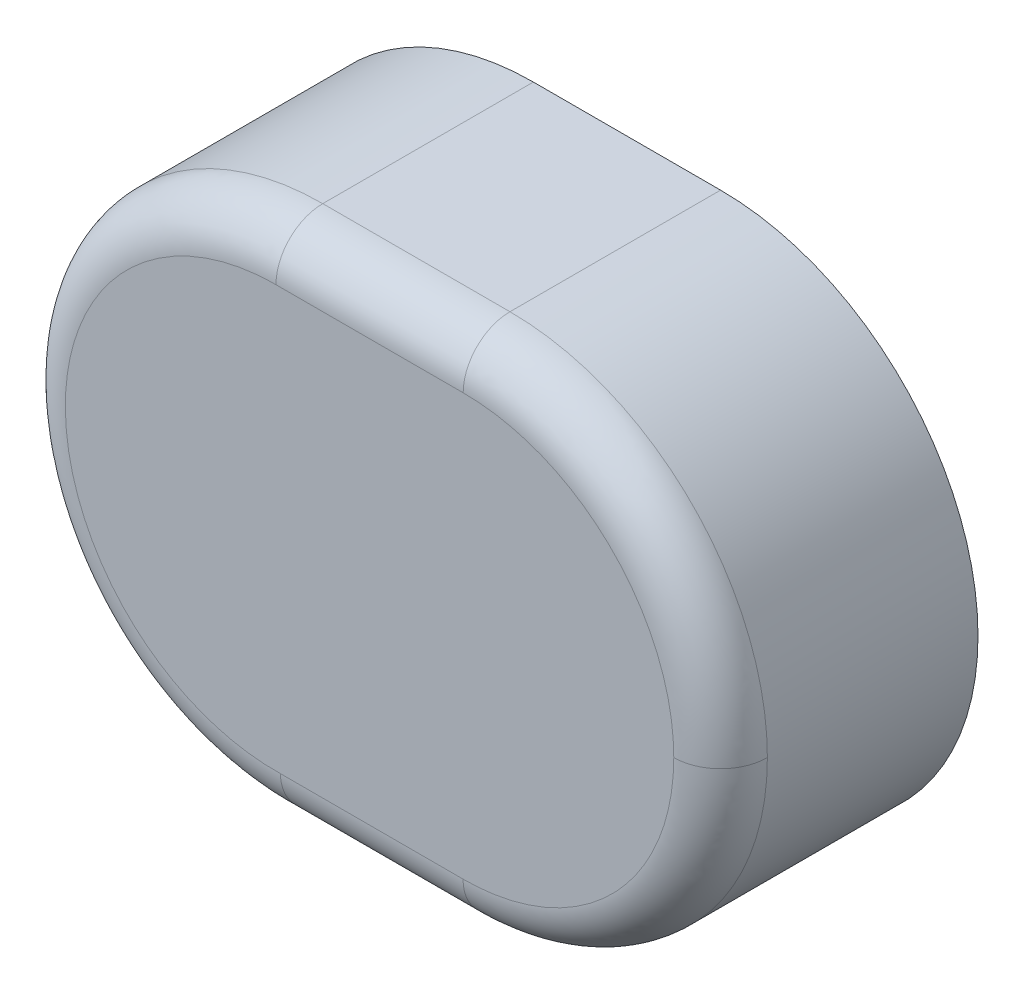
ISO-10303-21;
HEADER;
FILE_DESCRIPTION(('STEP AP214'),'2;1');
FILE_NAME('part.step','',(''),(''),'','','');
FILE_SCHEMA(('AUTOMOTIVE_DESIGN { 1 0 10303 214 1 1 1 1 }'));
ENDSEC;
DATA;
#1=APPLICATION_CONTEXT('core data for automotive mechanical design processes');
#2=APPLICATION_PROTOCOL_DEFINITION('international standard','automotive_design',2000,#1);
#3=PRODUCT_CONTEXT('',#1,'mechanical');
#4=PRODUCT('Part','Part','',(#3));
#5=PRODUCT_RELATED_PRODUCT_CATEGORY('part','',(#4));
#6=PRODUCT_DEFINITION_FORMATION('','',#4);
#7=PRODUCT_DEFINITION_CONTEXT('part definition',#1,'design');
#8=PRODUCT_DEFINITION('design','',#6,#7);
#9=PRODUCT_DEFINITION_SHAPE('','',#8);
#10=(LENGTH_UNIT() NAMED_UNIT(*) SI_UNIT(.MILLI.,.METRE.));
#11=(NAMED_UNIT(*) PLANE_ANGLE_UNIT() SI_UNIT($,.RADIAN.));
#12=(NAMED_UNIT(*) SI_UNIT($,.STERADIAN.) SOLID_ANGLE_UNIT());
#13=UNCERTAINTY_MEASURE_WITH_UNIT(LENGTH_MEASURE(1.E-05),#10,'distance_accuracy_value','');
#14=(GEOMETRIC_REPRESENTATION_CONTEXT(3) GLOBAL_UNCERTAINTY_ASSIGNED_CONTEXT((#13)) GLOBAL_UNIT_ASSIGNED_CONTEXT((#10,
#11,#12)) REPRESENTATION_CONTEXT('',''));
#15=CARTESIAN_POINT('',(0.,0.,0.));
#16=DIRECTION('',(0.,0.,1.));
#17=DIRECTION('',(1.,0.,0.));
#18=AXIS2_PLACEMENT_3D('',#15,#16,#17);
#19=CARTESIAN_POINT('',(-0.4,0.,1.1));
#20=DIRECTION('',(0.,0.,1.));
#21=DIRECTION('',(1.,0.,0.));
#22=AXIS2_PLACEMENT_3D('',#19,#20,#21);
#23=PLANE('',#22);
#24=CARTESIAN_POINT('',(0.4,0.9,1.1));
#25=CARTESIAN_POINT('',(0.927207793884,0.9,1.1));
#26=CARTESIAN_POINT('',(1.300000000025,0.527207793841,1.1));
#27=CARTESIAN_POINT('',(1.300000075144,-8.663971320906E-11,1.1));
#28=(BOUNDED_CURVE() B_SPLINE_CURVE(3,(#24,#25,#26,#27),.UNSPECIFIED.,.F.,
.F.) B_SPLINE_CURVE_WITH_KNOTS((4,4),(0.,0.499907037616),
.UNSPECIFIED.) CURVE() GEOMETRIC_REPRESENTATION_ITEM() RATIONAL_B_SPLINE_CURVE((1.,
0.804737854113,0.804737854113,1.)) REPRESENTATION_ITEM(''));
#29=CARTESIAN_POINT('',(0.4,0.9,1.1));
#30=VERTEX_POINT('',#29);
#31=CARTESIAN_POINT('',(1.300000075144,-8.663971320906E-11,1.1));
#32=VERTEX_POINT('',#31);
#33=EDGE_CURVE('E121',#30,#32,#28,.T.);
#34=ORIENTED_EDGE('',*,*,#33,.F.);
#35=DIRECTION('',(1.,0.,0.));
#36=VECTOR('',#35,1.);
#37=CARTESIAN_POINT('',(-0.4,0.9,1.1));
#38=LINE('',#37,#36);
#39=CARTESIAN_POINT('',(-0.4,0.9,1.1));
#40=VERTEX_POINT('',#39);
#41=EDGE_CURVE('E50',#40,#30,#38,.T.);
#42=ORIENTED_EDGE('',*,*,#41,.F.);
#43=CARTESIAN_POINT('',(-0.380779125953,-0.899794729347,1.1));
#44=CARTESIAN_POINT('',(-0.912340616922,-0.911149628008001,1.1));
#45=CARTESIAN_POINT('',(-1.294270909059,-0.541263423461,1.1));
#46=CARTESIAN_POINT('',(-1.299948681296,-0.009610985049351,1.1));
#47=CARTESIAN_POINT('',(-1.305626453533,0.522041453362,1.1));
#48=CARTESIAN_POINT('',(-0.931682755378,0.9,1.1));
#49=CARTESIAN_POINT('',(-0.4,0.9,1.1));
#50=(BOUNDED_CURVE() B_SPLINE_CURVE(3,(#43,#44,#45,#46,#47,#48,#49),.UNSPECIFIED.,.F.,
.F.) B_SPLINE_CURVE_WITH_KNOTS((4,3,4),(0.,0.5,1.),
.UNSPECIFIED.) CURVE() GEOMETRIC_REPRESENTATION_ITEM() RATIONAL_B_SPLINE_CURVE((1.,
0.802214063897,0.802214063897,1.,0.802214063897,0.802214063897,1.)) REPRESENTATION_ITEM(''));
#51=CARTESIAN_POINT('',(-0.380779125953,-0.899794729347,1.1));
#52=VERTEX_POINT('',#51);
#53=EDGE_CURVE('E198',#52,#40,#50,.T.);
#54=ORIENTED_EDGE('',*,*,#53,.F.);
#55=DIRECTION('',(-0.999999965443406,0.000262893868867007,0.));
#56=VECTOR('',#55,1.);
#57=CARTESIAN_POINT('',(-0.400236549179,-0.899789607352,1.1));
#58=LINE('',#57,#56);
#59=CARTESIAN_POINT('',(0.399474212286,-0.899999846415,1.1));
#60=VERTEX_POINT('',#59);
#61=EDGE_CURVE('E11',#60,#52,#58,.T.);
#62=ORIENTED_EDGE('',*,*,#61,.F.);
#63=CARTESIAN_POINT('',(1.300000075144,-8.663971320906E-11,1.1));
#64=CARTESIAN_POINT('',(1.299999999975,-0.527452036945,1.1));
#65=CARTESIAN_POINT('',(0.92692615918,-0.900307988415,1.1));
#66=CARTESIAN_POINT('',(0.399474212286,-0.899999846415,1.1));
#67=(BOUNDED_CURVE() B_SPLINE_CURVE(3,(#63,#64,#65,#66),.UNSPECIFIED.,.F.,
.F.) B_SPLINE_CURVE_WITH_KNOTS((4,4),(0.499907037616,1.),
.UNSPECIFIED.) CURVE() GEOMETRIC_REPRESENTATION_ITEM() RATIONAL_B_SPLINE_CURVE((1.,
0.804600134738,0.804600134738,1.)) REPRESENTATION_ITEM(''));
#68=EDGE_CURVE('E115',#32,#60,#67,.T.);
#69=ORIENTED_EDGE('',*,*,#68,.F.);
#70=EDGE_LOOP('',(#34,#42,#54,#62,#69));
#71=FACE_BOUND('',#70,.T.);
#72=ADVANCED_FACE('F17',(#71),#23,.T.);
#73=CARTESIAN_POINT('',(-0.400236549181,-0.899789615799,0.9));
#74=DIRECTION('',(-0.999999965443406,0.000262893868867007,0.));
#75=DIRECTION('',(-0.000262893868867007,-0.999999965443406,0.));
#76=AXIS2_PLACEMENT_3D('',#73,#74,#75);
#77=CYLINDRICAL_SURFACE('',#76,0.2);
#78=CARTESIAN_POINT('',(0.399474212282,-0.899999854862,0.9));
#79=DIRECTION('',(0.999999965443406,-0.000262893868867007,0.));
#80=DIRECTION('',(-0.000262893868867007,-0.999999965443406,0.));
#81=AXIS2_PLACEMENT_3D('',#78,#79,#80);
#82=CIRCLE('',#81,0.2);
#83=CARTESIAN_POINT('',(0.399421633509,-1.099999847951,0.9));
#84=VERTEX_POINT('',#83);
#85=EDGE_CURVE('E31',#60,#84,#82,.T.);
#86=ORIENTED_EDGE('',*,*,#85,.F.);
#87=ORIENTED_EDGE('',*,*,#61,.T.);
#88=CARTESIAN_POINT('',(-0.378777908656016,-1.09979526405521,0.9));
#89=CARTESIAN_POINT('',(-0.378754036193757,-1.09979485149569,0.902972997488492));
#90=CARTESIAN_POINT('',(-0.378731664842678,-1.0997280704236,0.905945997560975));
#91=CARTESIAN_POINT('',(-0.37868954140025,-1.09945976885765,0.911938418727411));
#92=CARTESIAN_POINT('',(-0.378669842390077,-1.09925589559782,0.914957735017651));
#93=CARTESIAN_POINT('',(-0.378633217989936,-1.09870685421041,0.921034407228906));
#94=CARTESIAN_POINT('',(-0.378616344467314,-1.09835938119942,0.924091555365059));
#95=CARTESIAN_POINT('',(-0.378585514464656,-1.09751724662697,0.930234649728027));
#96=CARTESIAN_POINT('',(-0.378571608170194,-1.09702035081032,0.933320290054966));
#97=CARTESIAN_POINT('',(-0.378546843884385,-1.09587417079679,0.939510304169306));
#98=CARTESIAN_POINT('',(-0.378536033944641,-1.09522274444302,0.942614281624328));
#99=CARTESIAN_POINT('',(-0.378517578444724,-1.09376314462121,0.948830144002926));
#100=CARTESIAN_POINT('',(-0.378509978346392,-1.09295294273639,0.951941552867778));
#101=CARTESIAN_POINT('',(-0.378498040930228,-1.09117238486836,0.958160771166421));
#102=CARTESIAN_POINT('',(-0.378493746045126,-1.09020013491605,0.961268038544205));
#103=CARTESIAN_POINT('',(-0.378488497273082,-1.08809313686472,0.967466886973775));
#104=CARTESIAN_POINT('',(-0.378487582377898,-1.08695664852416,0.970557876638921));
#105=CARTESIAN_POINT('',(-0.378489149345602,-1.08451998932997,0.976711622832444));
#106=CARTESIAN_POINT('',(-0.378491666388873,-1.08321824914562,0.979773758031562));
#107=CARTESIAN_POINT('',(-0.3785001285278,-1.08045114321288,0.985856926358591));
#108=CARTESIAN_POINT('',(-0.378506104676643,-1.07898439352437,0.988877329981482));
#109=CARTESIAN_POINT('',(-0.378521490204661,-1.07588862900864,0.994863997169959));
#110=CARTESIAN_POINT('',(-0.378530926261018,-1.07425842684191,0.997829646731975));
#111=CARTESIAN_POINT('',(-0.378553209439725,-1.07083846108,1.00369376395147));
#112=CARTESIAN_POINT('',(-0.378566078692304,-1.06904771420541,1.00659165811116));
#113=CARTESIAN_POINT('',(-0.378595178017505,-1.06531072090647,1.01230739225771));
#114=CARTESIAN_POINT('',(-0.378611425589011,-1.06336369860312,1.01512472490465));
#115=CARTESIAN_POINT('',(-0.378647203018098,-1.05931956272602,1.02066681059603));
#116=CARTESIAN_POINT('',(-0.378666745751308,-1.05722187966446,1.02339114800928));
#117=CARTESIAN_POINT('',(-0.378709007037604,-1.05288313768865,1.02873524090113));
#118=CARTESIAN_POINT('',(-0.378731733946368,-1.0506417102456,1.03135469712094));
#119=CARTESIAN_POINT('',(-0.378780230112621,-1.04602343546422,1.03647771865106));
#120=CARTESIAN_POINT('',(-0.378806003403588,-1.04364641079473,1.03898112406548));
#121=CARTESIAN_POINT('',(-0.378860433345164,-1.03876604531191,1.04386158768415));
#122=CARTESIAN_POINT('',(-0.378889089994916,-1.03626270453609,1.04623864592592));
#123=CARTESIAN_POINT('',(-0.378949104160728,-1.03113984169101,1.0508569552979));
#124=CARTESIAN_POINT('',(-0.378980458011787,-1.02852047955118,1.05309838387966));
#125=CARTESIAN_POINT('',(-0.379045663069837,-1.02317660240385,1.05743709443839));
#126=CARTESIAN_POINT('',(-0.379079507389302,-1.02045238665186,1.05953474511283));
#127=CARTESIAN_POINT('',(-0.379149471746614,-1.01491056983084,1.06357878166556));
#128=CARTESIAN_POINT('',(-0.37918558217396,-1.01209338435821,1.06552573725056));
#129=CARTESIAN_POINT('',(-0.379259842189707,-1.0063779678881,1.06926256199871));
#130=CARTESIAN_POINT('',(-0.379297979986713,-1.00348024417013,1.07105320731095));
#131=CARTESIAN_POINT('',(-0.379376046694424,-0.99761648879174,1.07447293456294));
#132=CARTESIAN_POINT('',(-0.379415962200891,-0.994651030549239,1.07610300010326));
#133=CARTESIAN_POINT('',(-0.379497328341799,-0.988664764472242,1.07919845599785));
#134=CARTESIAN_POINT('',(-0.379538764536301,-0.985644570548345,1.08066503406282));
#135=CARTESIAN_POINT('',(-0.379622911701828,-0.979561837527449,1.08343176167503));
#136=CARTESIAN_POINT('',(-0.379665607767027,-0.976499927835743,1.08473329558165));
#137=CARTESIAN_POINT('',(-0.379752013453864,-0.970346645957682,1.08716950770469));
#138=CARTESIAN_POINT('',(-0.379795708251053,-0.96725589500027,1.08830575571644));
#139=CARTESIAN_POINT('',(-0.379883852645861,-0.961057534670954,1.09041223939604));
#140=CARTESIAN_POINT('',(-0.379928288011695,-0.957950516590615,1.09138421581195));
#141=CARTESIAN_POINT('',(-0.380017660345577,-0.951731804980451,1.09316419391585));
#142=CARTESIAN_POINT('',(-0.380062584138629,-0.948620653422168,1.09397409011737));
#143=CARTESIAN_POINT('',(-0.380152688471447,-0.942405311214057,1.09543304710009));
#144=CARTESIAN_POINT('',(-0.380197857301428,-0.939301596553903,1.09608413687602));
#145=CARTESIAN_POINT('',(-0.380288217651549,-0.933112111132864,1.09722961364919));
#146=CARTESIAN_POINT('',(-0.380333399273606,-0.930026736654881,1.09772614341015));
#147=CARTESIAN_POINT('',(-0.380423563948389,-0.923884174744724,1.09856751731588));
#148=CARTESIAN_POINT('',(-0.380468539197128,-0.920827293186012,1.09891459634674));
#149=CARTESIAN_POINT('',(-0.380558084547499,-0.914751152664416,1.09946282285997));
#150=CARTESIAN_POINT('',(-0.380602649152329,-0.911732101485765,1.09966627587597));
#151=CARTESIAN_POINT('',(-0.380691181777354,-0.905740206988542,1.09993371177135));
#152=CARTESIAN_POINT('',(-0.380735146770091,-0.902767468501069,1.10000004808143));
#153=CARTESIAN_POINT('',(-0.380779125916932,-0.899794731035435,1.1));
#154=B_SPLINE_CURVE_WITH_KNOTS('',3,(#88,#89,#90,#91,#92,#93,#94,#95,#96,#97,#98,#99,#100,#101,
#102,#103,#104,#105,#106,#107,#108,#109,#110,#111,#112,#113,#114,#115,#116,#117,#118,#119,#120,
#121,#122,#123,#124,#125,#126,#127,#128,#129,#130,#131,#132,#133,#134,#135,#136,#137,#138,#139,
#140,#141,#142,#143,#144,#145,#146,#147,#148,#149,#150,#151,#152,#153),.UNSPECIFIED.,.F.,.F.,(4,
2,2,2,2,2,2,2,2,2,2,2,2,2,2,2,2,2,2,2,2,2,2,2,2,2,2,2,2,2,2,2,4),(0.,0.00891854816367091,
0.0179942000842322,0.0272215582811506,0.0365943984439681,0.046105660467459,0.0557474491846384,
0.0655110457017221,0.0753869300517504,0.0853648156480489,0.0954336957399128,0.105581901758877,
0.11579717310587,0.126066737581289,0.136377401317439,0.146715646752711,0.157067736906173,
0.167419823985228,0.177758060200585,0.188068708581192,0.198338251581763,0.208553495357148,
0.21870166773622,0.22877050815395,0.238748348081058,0.248624180810689,0.258387719804175,
0.268029445146173,0.277540637997577,0.286913403248578,0.296140680853072,0.305216246561131,
0.314134702953651),.UNSPECIFIED.);
#155=CARTESIAN_POINT('',(-0.378777908656,-1.099795264056,0.9));
#156=VERTEX_POINT('',#155);
#157=EDGE_CURVE('E206',#156,#52,#154,.T.);
#158=ORIENTED_EDGE('',*,*,#157,.F.);
#159=DIRECTION('',(0.999999965443406,-0.000262893868867007,0.));
#160=VECTOR('',#159,1.);
#161=CARTESIAN_POINT('',(-0.378777908656,-1.099795264056,0.9));
#162=LINE('',#161,#160);
#163=EDGE_CURVE('E196',#156,#84,#162,.T.);
#164=ORIENTED_EDGE('',*,*,#163,.T.);
#165=EDGE_LOOP('',(#86,#87,#158,#164));
#166=FACE_BOUND('',#165,.T.);
#167=ADVANCED_FACE('F240',(#166),#77,.T.);
#168=CARTESIAN_POINT('',(0.390988907926,-0.89995488788,1.1));
#169=CARTESIAN_POINT('',(0.922365061059,-0.905275465063,1.1));
#170=CARTESIAN_POINT('',(1.3,-0.531402789474,1.1));
#171=CARTESIAN_POINT('',(1.3,0.,1.1));
#172=CARTESIAN_POINT('',(0.389815891142,-1.017106302946,1.1));
#173=CARTESIAN_POINT('',(0.990363809561001,-1.023119485008,1.1));
#174=CARTESIAN_POINT('',(1.417157287525,-0.600578022139,1.1));
#175=CARTESIAN_POINT('',(1.417157287525,0.,1.1));
#176=CARTESIAN_POINT('',(0.38898644302,-1.099944862965,1.017157287525));
#177=CARTESIAN_POINT('',(1.038446185739,-1.106447790633,1.017157287525));
#178=CARTESIAN_POINT('',(1.5,-0.649492298246,1.017157287525));
#179=CARTESIAN_POINT('',(1.5,0.,1.017157287525));
#180=CARTESIAN_POINT('',(0.38898644302,-1.099944862965,0.9));
#181=CARTESIAN_POINT('',(1.038446185739,-1.106447790633,0.9));
#182=CARTESIAN_POINT('',(1.5,-0.649492298246,0.9));
#183=CARTESIAN_POINT('',(1.5,0.,0.9));
#184=(BOUNDED_SURFACE() B_SPLINE_SURFACE(3,3,((#168,#169,#170,#171),(#172,#173,#174,#175),(#176,
#177,#178,#179),(#180,#181,#182,#183)),.UNSPECIFIED.,.F.,.F.,
.F.) B_SPLINE_SURFACE_WITH_KNOTS((4,4),(4,4),(0.,1.),(0.,1.),
.UNSPECIFIED.) GEOMETRIC_REPRESENTATION_ITEM() RATIONAL_B_SPLINE_SURFACE(((1.,0.802371989753,
0.802371989753,1.),(0.804737854124,0.645699113244,0.645699113244,0.804737854124),
(0.804737854124,0.645699113244,0.645699113244,0.804737854124),(1.,0.802371989753,0.802371989753,1.))) REPRESENTATION_ITEM('') SURFACE());
#185=CARTESIAN_POINT('',(1.3,0.,0.9));
#186=DIRECTION('',(0.,1.,0.));
#187=DIRECTION('',(1.,0.,0.));
#188=AXIS2_PLACEMENT_3D('',#185,#186,#187);
#189=CIRCLE('',#188,0.2);
#190=CARTESIAN_POINT('',(1.5,0.,0.9));
#191=VERTEX_POINT('',#190);
#192=EDGE_CURVE('E130',#32,#191,#189,.T.);
#193=CARTESIAN_POINT('',(0.4,0.,0.9));
#194=DIRECTION('',(0.,0.,-1.));
#195=DIRECTION('',(-1.,0.,0.));
#196=AXIS2_PLACEMENT_3D('',#193,#194,#195);
#197=CIRCLE('',#196,1.1);
#198=EDGE_CURVE('E192',#191,#84,#197,.T.);
#199=ORIENTED_EDGE('',*,*,#192,.F.);
#200=ORIENTED_EDGE('',*,*,#68,.T.);
#201=ORIENTED_EDGE('',*,*,#85,.T.);
#202=ORIENTED_EDGE('',*,*,#198,.F.);
#203=EDGE_LOOP('',(#199,#200,#201,#202));
#204=FACE_BOUND('',#203,.T.);
#205=ADVANCED_FACE('F19',(#204),#184,.T.);
#206=CARTESIAN_POINT('',(-0.4,0.9,0.9));
#207=DIRECTION('',(1.,0.,0.));
#208=DIRECTION('',(0.,1.,0.));
#209=AXIS2_PLACEMENT_3D('',#206,#207,#208);
#210=CYLINDRICAL_SURFACE('',#209,0.2);
#211=CARTESIAN_POINT('',(-0.4,0.9,0.9));
#212=DIRECTION('',(-1.,0.,0.));
#213=DIRECTION('',(0.,1.,0.));
#214=AXIS2_PLACEMENT_3D('',#211,#212,#213);
#215=CIRCLE('',#214,0.2);
#216=CARTESIAN_POINT('',(-0.4,1.1,0.9));
#217=VERTEX_POINT('',#216);
#218=EDGE_CURVE('E112',#40,#217,#215,.T.);
#219=ORIENTED_EDGE('',*,*,#218,.F.);
#220=ORIENTED_EDGE('',*,*,#41,.T.);
#221=CARTESIAN_POINT('',(0.4,0.9,0.9));
#222=DIRECTION('',(-1.,0.,0.));
#223=DIRECTION('',(0.,1.,0.));
#224=AXIS2_PLACEMENT_3D('',#221,#222,#223);
#225=CIRCLE('',#224,0.2);
#226=CARTESIAN_POINT('',(0.4,1.1,0.9));
#227=VERTEX_POINT('',#226);
#228=EDGE_CURVE('E110',#30,#227,#225,.T.);
#229=ORIENTED_EDGE('',*,*,#228,.T.);
#230=DIRECTION('',(-1.,0.,0.));
#231=VECTOR('',#230,1.);
#232=CARTESIAN_POINT('',(0.4,1.1,0.9));
#233=LINE('',#232,#231);
#234=EDGE_CURVE('E147',#227,#217,#233,.T.);
#235=ORIENTED_EDGE('',*,*,#234,.T.);
#236=EDGE_LOOP('',(#219,#220,#229,#235));
#237=FACE_BOUND('',#236,.T.);
#238=ADVANCED_FACE('F108',(#237),#210,.T.);
#239=CARTESIAN_POINT('',(-0.4,0.9,1.1));
#240=CARTESIAN_POINT('',(-0.935677416734,0.9,1.1));
#241=CARTESIAN_POINT('',(-1.310619741845,0.517418573845,1.1));
#242=CARTESIAN_POINT('',(-1.299816970816,-0.01814990444342,1.1));
#243=CARTESIAN_POINT('',(-1.289014199787,-0.553718382732,1.1));
#244=CARTESIAN_POINT('',(-0.898949280513999,-0.920869105939,1.1));
#245=CARTESIAN_POINT('',(-0.363707573251,-0.899267957708,1.1));
#246=CARTESIAN_POINT('',(-0.4,1.017157287525,1.1));
#247=CARTESIAN_POINT('',(-1.005409097993,1.017157287525,1.1));
#248=CARTESIAN_POINT('',(-1.429159451758,0.584773414542,1.1));
#249=CARTESIAN_POINT('',(-1.416950432561,-0.02051256396945,1.1));
#250=CARTESIAN_POINT('',(-1.404741413363,-0.625798542481,1.1));
#251=CARTESIAN_POINT('',(-0.963899885312,-1.040743024403,1.1));
#252=CARTESIAN_POINT('',(-0.358983215167,-1.016329951801,1.1));
#253=CARTESIAN_POINT('',(-0.4,1.1,1.017157287525));
#254=CARTESIAN_POINT('',(-1.054716842675,1.1,1.017157287525));
#255=CARTESIAN_POINT('',(-1.512979684478,0.632400479144,1.017157287525));
#256=CARTESIAN_POINT('',(-1.499776297664,-0.02218321654195,1.017157287525));
#257=CARTESIAN_POINT('',(-1.486572910851,-0.676766912228,1.017157287525));
#258=CARTESIAN_POINT('',(-1.009826898406,-1.125506685037,1.017157287525));
#259=CARTESIAN_POINT('',(-0.355642589529,-1.099105281643,1.017157287525));
#260=CARTESIAN_POINT('',(-0.4,1.1,0.9));
#261=CARTESIAN_POINT('',(-1.054716842675,1.1,0.9));
#262=CARTESIAN_POINT('',(-1.512979684478,0.632400479144,0.9));
#263=CARTESIAN_POINT('',(-1.499776297664,-0.02218321654195,0.9));
#264=CARTESIAN_POINT('',(-1.486572910851,-0.676766912228,0.9));
#265=CARTESIAN_POINT('',(-1.009826898406,-1.125506685037,0.9));
#266=CARTESIAN_POINT('',(-0.355642589529,-1.099105281643,0.9));
#267=(BOUNDED_SURFACE() B_SPLINE_SURFACE(3,3,((#239,#240,#241,#242,#243,#244,#245),(#246,#247,
#248,#249,#250,#251,#252),(#253,#254,#255,#256,#257,#258,#259),(#260,#261,#262,#263,#264,#265,
#266)),.UNSPECIFIED.,.F.,.F.,.F.) B_SPLINE_SURFACE_WITH_KNOTS((4,4),(4,3,4),(0.,1.),(0.,0.5,1.),
.UNSPECIFIED.) GEOMETRIC_REPRESENTATION_ITEM() RATIONAL_B_SPLINE_SURFACE(((1.,0.799960341055,
0.799960341055,1.,0.799960341055,0.799960341055,1.),(0.804737854124,0.643758368245,
0.643758368245,0.804737854124,0.643758368245,0.643758368245,0.804737854124),(0.804737854124,
0.643758368245,0.643758368245,0.804737854124,0.643758368245,0.643758368245,0.804737854124),(1.,
0.799960341055,0.799960341055,1.,0.799960341055,0.799960341055,1.))) REPRESENTATION_ITEM('') SURFACE());
#268=CARTESIAN_POINT('',(-0.4,0.,0.9));
#269=DIRECTION('',(0.,0.,-1.));
#270=DIRECTION('',(-1.,0.,0.));
#271=AXIS2_PLACEMENT_3D('',#268,#269,#270);
#272=CIRCLE('',#271,1.1);
#273=CARTESIAN_POINT('',(-1.5,0.,0.9));
#274=VERTEX_POINT('',#273);
#275=EDGE_CURVE('E148',#274,#217,#272,.T.);
#276=CARTESIAN_POINT('',(-0.4,0.,0.9));
#277=DIRECTION('',(0.,0.,-1.));
#278=DIRECTION('',(-1.,0.,0.));
#279=AXIS2_PLACEMENT_3D('',#276,#277,#278);
#280=CIRCLE('',#279,1.1);
#281=EDGE_CURVE('E125',#156,#274,#280,.T.);
#282=ORIENTED_EDGE('',*,*,#157,.T.);
#283=ORIENTED_EDGE('',*,*,#53,.T.);
#284=ORIENTED_EDGE('',*,*,#218,.T.);
#285=ORIENTED_EDGE('',*,*,#275,.F.);
#286=ORIENTED_EDGE('',*,*,#281,.F.);
#287=EDGE_LOOP('',(#282,#283,#284,#285,#286));
#288=FACE_BOUND('',#287,.T.);
#289=ADVANCED_FACE('F212',(#288),#267,.T.);
#290=CARTESIAN_POINT('',(-0.378777908656,-1.099795264056,1.1));
#291=DIRECTION('',(0.000262893868867007,0.999999965443406,0.));
#292=DIRECTION('',(0.,0.,-1.));
#293=AXIS2_PLACEMENT_3D('',#290,#291,#292);
#294=PLANE('',#293);
#295=ORIENTED_EDGE('',*,*,#163,.F.);
#296=DIRECTION('',(0.,0.,1.));
#297=VECTOR('',#296,1.);
#298=CARTESIAN_POINT('',(-0.378777908656,-1.099795264056,1.1));
#299=LINE('',#298,#297);
#300=CARTESIAN_POINT('',(-0.378777908656,-1.099795264056,0.));
#301=VERTEX_POINT('',#300);
#302=EDGE_CURVE('E171',#301,#156,#299,.T.);
#303=ORIENTED_EDGE('',*,*,#302,.F.);
#304=DIRECTION('',(0.999999965443406,-0.000262893868867207,0.));
#305=VECTOR('',#304,1.);
#306=CARTESIAN_POINT('',(-0.378777908656,-1.099795264056,0.));
#307=LINE('',#306,#305);
#308=CARTESIAN_POINT('',(0.399421633509,-1.099999847951,0.));
#309=VERTEX_POINT('',#308);
#310=EDGE_CURVE('E162',#301,#309,#307,.T.);
#311=ORIENTED_EDGE('',*,*,#310,.T.);
#312=DIRECTION('',(0.,0.,-1.));
#313=VECTOR('',#312,1.);
#314=CARTESIAN_POINT('',(0.399421633509,-1.099999847951,1.1));
#315=LINE('',#314,#313);
#316=EDGE_CURVE('E189',#84,#309,#315,.T.);
#317=ORIENTED_EDGE('',*,*,#316,.F.);
#318=EDGE_LOOP('',(#295,#303,#311,#317));
#319=FACE_BOUND('',#318,.T.);
#320=ADVANCED_FACE('F224',(#319),#294,.F.);
#321=CARTESIAN_POINT('',(0.4,0.,1.1));
#322=DIRECTION('',(0.,0.,-1.));
#323=DIRECTION('',(-1.,0.,0.));
#324=AXIS2_PLACEMENT_3D('',#321,#322,#323);
#325=CYLINDRICAL_SURFACE('',#324,1.1);
#326=ORIENTED_EDGE('',*,*,#316,.T.);
#327=CARTESIAN_POINT('',(0.4,0.,0.));
#328=DIRECTION('',(0.,0.,1.));
#329=DIRECTION('',(-1.,0.,0.));
#330=AXIS2_PLACEMENT_3D('',#327,#328,#329);
#331=CIRCLE('',#330,1.1);
#332=CARTESIAN_POINT('',(0.4,1.1,0.));
#333=VERTEX_POINT('',#332);
#334=EDGE_CURVE('E167',#309,#333,#331,.T.);
#335=ORIENTED_EDGE('',*,*,#334,.T.);
#336=DIRECTION('',(0.,0.,1.));
#337=VECTOR('',#336,1.);
#338=CARTESIAN_POINT('',(0.4,1.1,1.1));
#339=LINE('',#338,#337);
#340=EDGE_CURVE('E183',#333,#227,#339,.T.);
#341=ORIENTED_EDGE('',*,*,#340,.T.);
#342=CARTESIAN_POINT('',(0.4,0.,0.9));
#343=DIRECTION('',(0.,0.,-1.));
#344=DIRECTION('',(-1.,0.,0.));
#345=AXIS2_PLACEMENT_3D('',#342,#343,#344);
#346=CIRCLE('',#345,1.1);
#347=EDGE_CURVE('E123',#227,#191,#346,.T.);
#348=ORIENTED_EDGE('',*,*,#347,.T.);
#349=ORIENTED_EDGE('',*,*,#198,.T.);
#350=EDGE_LOOP('',(#326,#335,#341,#348,#349));
#351=FACE_BOUND('',#350,.T.);
#352=ADVANCED_FACE('F225',(#351),#325,.T.);
#353=CARTESIAN_POINT('',(0.4,1.1,1.1));
#354=DIRECTION('',(0.,-1.,0.));
#355=DIRECTION('',(-1.,0.,0.));
#356=AXIS2_PLACEMENT_3D('',#353,#354,#355);
#357=PLANE('',#356);
#358=ORIENTED_EDGE('',*,*,#234,.F.);
#359=ORIENTED_EDGE('',*,*,#340,.F.);
#360=DIRECTION('',(-1.,0.,0.));
#361=VECTOR('',#360,1.);
#362=CARTESIAN_POINT('',(-0.4,1.1,0.));
#363=LINE('',#362,#361);
#364=CARTESIAN_POINT('',(-0.4,1.1,0.));
#365=VERTEX_POINT('',#364);
#366=EDGE_CURVE('E174',#333,#365,#363,.T.);
#367=ORIENTED_EDGE('',*,*,#366,.T.);
#368=DIRECTION('',(0.,0.,-1.));
#369=VECTOR('',#368,1.);
#370=CARTESIAN_POINT('',(-0.4,1.1,1.1));
#371=LINE('',#370,#369);
#372=EDGE_CURVE('E145',#217,#365,#371,.T.);
#373=ORIENTED_EDGE('',*,*,#372,.F.);
#374=EDGE_LOOP('',(#358,#359,#367,#373));
#375=FACE_BOUND('',#374,.T.);
#376=ADVANCED_FACE('F362',(#375),#357,.F.);
#377=CARTESIAN_POINT('',(-0.4,0.,1.1));
#378=DIRECTION('',(0.,0.,-1.));
#379=DIRECTION('',(-1.,0.,0.));
#380=AXIS2_PLACEMENT_3D('',#377,#378,#379);
#381=CYLINDRICAL_SURFACE('',#380,1.1);
#382=DIRECTION('',(0.,0.,-1.));
#383=VECTOR('',#382,1.);
#384=CARTESIAN_POINT('',(-1.5,0.,1.1));
#385=LINE('',#384,#383);
#386=CARTESIAN_POINT('',(-1.5,0.,0.));
#387=VERTEX_POINT('',#386);
#388=EDGE_CURVE('E154',#274,#387,#385,.T.);
#389=ORIENTED_EDGE('',*,*,#388,.F.);
#390=ORIENTED_EDGE('',*,*,#275,.T.);
#391=ORIENTED_EDGE('',*,*,#372,.T.);
#392=CARTESIAN_POINT('',(-0.4,0.,0.));
#393=DIRECTION('',(0.,0.,1.));
#394=DIRECTION('',(-1.,0.,0.));
#395=AXIS2_PLACEMENT_3D('',#392,#393,#394);
#396=CIRCLE('',#395,1.1);
#397=EDGE_CURVE('E166',#365,#387,#396,.T.);
#398=ORIENTED_EDGE('',*,*,#397,.T.);
#399=EDGE_LOOP('',(#389,#390,#391,#398));
#400=FACE_BOUND('',#399,.T.);
#401=ADVANCED_FACE('F254',(#400),#381,.T.);
#402=CARTESIAN_POINT('',(-0.4,0.,0.));
#403=DIRECTION('',(0.,0.,1.));
#404=DIRECTION('',(1.,0.,0.));
#405=AXIS2_PLACEMENT_3D('',#402,#403,#404);
#406=PLANE('',#405);
#407=ORIENTED_EDGE('',*,*,#366,.F.);
#408=ORIENTED_EDGE('',*,*,#334,.F.);
#409=ORIENTED_EDGE('',*,*,#310,.F.);
#410=CARTESIAN_POINT('',(-0.4,0.,0.));
#411=DIRECTION('',(0.,0.,1.));
#412=DIRECTION('',(-1.,0.,0.));
#413=AXIS2_PLACEMENT_3D('',#410,#411,#412);
#414=CIRCLE('',#413,1.1);
#415=EDGE_CURVE('E161',#387,#301,#414,.T.);
#416=ORIENTED_EDGE('',*,*,#415,.F.);
#417=ORIENTED_EDGE('',*,*,#397,.F.);
#418=EDGE_LOOP('',(#407,#408,#409,#416,#417));
#419=FACE_BOUND('',#418,.T.);
#420=ADVANCED_FACE('F251',(#419),#406,.F.);
#421=CARTESIAN_POINT('',(-0.4,0.,1.1));
#422=DIRECTION('',(0.,0.,-1.));
#423=DIRECTION('',(-1.,0.,0.));
#424=AXIS2_PLACEMENT_3D('',#421,#422,#423);
#425=CYLINDRICAL_SURFACE('',#424,1.1);
#426=ORIENTED_EDGE('',*,*,#281,.T.);
#427=ORIENTED_EDGE('',*,*,#388,.T.);
#428=ORIENTED_EDGE('',*,*,#415,.T.);
#429=ORIENTED_EDGE('',*,*,#302,.T.);
#430=EDGE_LOOP('',(#426,#427,#428,#429));
#431=FACE_BOUND('',#430,.T.);
#432=ADVANCED_FACE('F376',(#431),#425,.T.);
#433=CARTESIAN_POINT('',(1.3,-4.331960254564E-11,1.1));
#434=CARTESIAN_POINT('',(1.300000000025,0.527207793841,1.1));
#435=CARTESIAN_POINT('',(0.927207793884,0.9,1.1));
#436=CARTESIAN_POINT('',(0.4,0.9,1.1));
#437=CARTESIAN_POINT('',(1.417157287525,-4.89586651257E-11,1.1));
#438=CARTESIAN_POINT('',(1.417157287554,0.59583694394,1.1));
#439=CARTESIAN_POINT('',(0.995836943988,1.017157287525,1.1));
#440=CARTESIAN_POINT('',(0.4,1.017157287525,1.1));
#441=CARTESIAN_POINT('',(1.5,-5.294608451559E-11,1.017157287525));
#442=CARTESIAN_POINT('',(1.500000000031,0.644365081361,1.017157287525));
#443=CARTESIAN_POINT('',(1.044365081414,1.1,1.017157287525));
#444=CARTESIAN_POINT('',(0.4,1.1,1.017157287525));
#445=CARTESIAN_POINT('',(1.5,-5.294608451559E-11,0.9));
#446=CARTESIAN_POINT('',(1.500000000031,0.644365081361,0.9));
#447=CARTESIAN_POINT('',(1.044365081414,1.1,0.9));
#448=CARTESIAN_POINT('',(0.4,1.1,0.9));
#449=(BOUNDED_SURFACE() B_SPLINE_SURFACE(3,3,((#433,#434,#435,#436),(#437,#438,#439,#440),(#441,
#442,#443,#444),(#445,#446,#447,#448)),.UNSPECIFIED.,.F.,.F.,
.F.) B_SPLINE_SURFACE_WITH_KNOTS((4,4),(4,4),(0.,1.),(0.,1.),
.UNSPECIFIED.) GEOMETRIC_REPRESENTATION_ITEM() RATIONAL_B_SPLINE_SURFACE(((1.,0.804737854113,
0.804737854113,1.),(0.804737854124,0.647603013852,0.647603013852,0.804737854124),
(0.804737854124,0.647603013852,0.647603013852,0.804737854124),(1.,0.804737854113,0.804737854113,1.))) REPRESENTATION_ITEM('') SURFACE());
#450=ORIENTED_EDGE('',*,*,#33,.T.);
#451=ORIENTED_EDGE('',*,*,#192,.T.);
#452=ORIENTED_EDGE('',*,*,#347,.F.);
#453=ORIENTED_EDGE('',*,*,#228,.F.);
#454=EDGE_LOOP('',(#450,#451,#452,#453));
#455=FACE_BOUND('',#454,.T.);
#456=ADVANCED_FACE('F119',(#455),#449,.T.);
#457=CLOSED_SHELL('',(#72,#167,#205,#238,#289,#320,#352,#376,#401,#420,#432,#456));
#458=MANIFOLD_SOLID_BREP('B1',#457);
#459=ADVANCED_BREP_SHAPE_REPRESENTATION('',(#18,#458),#14);
#460=SHAPE_DEFINITION_REPRESENTATION(#9,#459);
ENDSEC;
END-ISO-10303-21;
